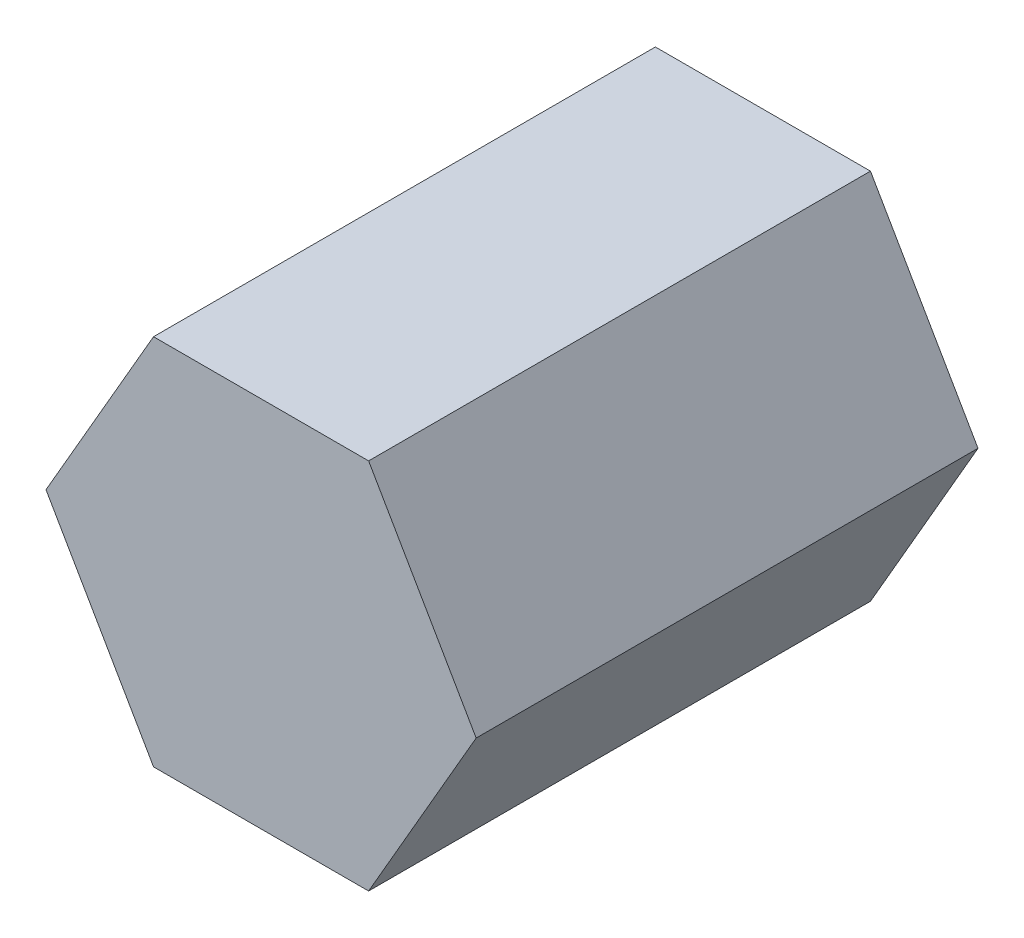
ISO-10303-21;
HEADER;
FILE_DESCRIPTION(('STEP AP214'),'2;1');
FILE_NAME('part.step','',(''),(''),'','','');
FILE_SCHEMA(('AUTOMOTIVE_DESIGN { 1 0 10303 214 1 1 1 1 }'));
ENDSEC;
DATA;
#1=APPLICATION_CONTEXT('core data for automotive mechanical design processes');
#2=APPLICATION_PROTOCOL_DEFINITION('international standard','automotive_design',2000,#1);
#3=PRODUCT_CONTEXT('',#1,'mechanical');
#4=PRODUCT('Part','Part','',(#3));
#5=PRODUCT_RELATED_PRODUCT_CATEGORY('part','',(#4));
#6=PRODUCT_DEFINITION_FORMATION('','',#4);
#7=PRODUCT_DEFINITION_CONTEXT('part definition',#1,'design');
#8=PRODUCT_DEFINITION('design','',#6,#7);
#9=PRODUCT_DEFINITION_SHAPE('','',#8);
#10=(LENGTH_UNIT() NAMED_UNIT(*) SI_UNIT(.MILLI.,.METRE.));
#11=(NAMED_UNIT(*) PLANE_ANGLE_UNIT() SI_UNIT($,.RADIAN.));
#12=(NAMED_UNIT(*) SI_UNIT($,.STERADIAN.) SOLID_ANGLE_UNIT());
#13=UNCERTAINTY_MEASURE_WITH_UNIT(LENGTH_MEASURE(1.E-05),#10,'distance_accuracy_value','');
#14=(GEOMETRIC_REPRESENTATION_CONTEXT(3) GLOBAL_UNCERTAINTY_ASSIGNED_CONTEXT((#13)) GLOBAL_UNIT_ASSIGNED_CONTEXT((#10,
#11,#12)) REPRESENTATION_CONTEXT('',''));
#15=CARTESIAN_POINT('',(0.,0.,0.));
#16=DIRECTION('',(0.,0.,1.));
#17=DIRECTION('',(1.,0.,0.));
#18=AXIS2_PLACEMENT_3D('',#15,#16,#17);
#19=CARTESIAN_POINT('',(-1.5,-2.59807621135332,7.));
#20=DIRECTION('',(0.,1.,0.));
#21=DIRECTION('',(-1.,0.,0.));
#22=AXIS2_PLACEMENT_3D('',#19,#20,#21);
#23=PLANE('',#22);
#24=DIRECTION('',(1.,0.,0.));
#25=VECTOR('',#24,1.);
#26=CARTESIAN_POINT('',(-1.5,-2.59807621135332,0.));
#27=LINE('',#26,#25);
#28=CARTESIAN_POINT('',(-1.5,-2.59807621135332,0.));
#29=VERTEX_POINT('',#28);
#30=CARTESIAN_POINT('',(1.5,-2.59807621135332,0.));
#31=VERTEX_POINT('',#30);
#32=EDGE_CURVE('E117',#29,#31,#27,.T.);
#33=ORIENTED_EDGE('',*,*,#32,.T.);
#34=DIRECTION('',(0.,0.,-1.));
#35=VECTOR('',#34,1.);
#36=CARTESIAN_POINT('',(1.5,-2.59807621135332,7.));
#37=LINE('',#36,#35);
#38=CARTESIAN_POINT('',(1.5,-2.59807621135332,7.));
#39=VERTEX_POINT('',#38);
#40=EDGE_CURVE('E11',#39,#31,#37,.T.);
#41=ORIENTED_EDGE('',*,*,#40,.F.);
#42=DIRECTION('',(1.,0.,0.));
#43=VECTOR('',#42,1.);
#44=CARTESIAN_POINT('',(-1.5,-2.59807621135332,7.));
#45=LINE('',#44,#43);
#46=CARTESIAN_POINT('',(-1.5,-2.59807621135332,7.));
#47=VERTEX_POINT('',#46);
#48=EDGE_CURVE('E127',#47,#39,#45,.T.);
#49=ORIENTED_EDGE('',*,*,#48,.F.);
#50=DIRECTION('',(0.,0.,-1.));
#51=VECTOR('',#50,1.);
#52=CARTESIAN_POINT('',(-1.5,-2.59807621135332,7.));
#53=LINE('',#52,#51);
#54=EDGE_CURVE('E113',#47,#29,#53,.T.);
#55=ORIENTED_EDGE('',*,*,#54,.T.);
#56=EDGE_LOOP('',(#33,#41,#49,#55));
#57=FACE_BOUND('',#56,.T.);
#58=ADVANCED_FACE('F33',(#57),#23,.F.);
#59=CARTESIAN_POINT('',(1.5,-2.59807621135332,7.));
#60=DIRECTION('',(-0.866025403784439,0.5,0.));
#61=DIRECTION('',(-0.5,-0.866025403784439,0.));
#62=AXIS2_PLACEMENT_3D('',#59,#60,#61);
#63=PLANE('',#62);
#64=DIRECTION('',(0.5,0.866025403784439,0.));
#65=VECTOR('',#64,1.);
#66=CARTESIAN_POINT('',(1.5,-2.59807621135332,0.));
#67=LINE('',#66,#65);
#68=CARTESIAN_POINT('',(3.,0.,0.));
#69=VERTEX_POINT('',#68);
#70=EDGE_CURVE('E120',#31,#69,#67,.T.);
#71=ORIENTED_EDGE('',*,*,#70,.T.);
#72=DIRECTION('',(0.,0.,-1.));
#73=VECTOR('',#72,1.);
#74=CARTESIAN_POINT('',(3.,0.,7.));
#75=LINE('',#74,#73);
#76=CARTESIAN_POINT('',(3.,0.,7.));
#77=VERTEX_POINT('',#76);
#78=EDGE_CURVE('E41',#77,#69,#75,.T.);
#79=ORIENTED_EDGE('',*,*,#78,.F.);
#80=DIRECTION('',(0.5,0.866025403784439,0.));
#81=VECTOR('',#80,1.);
#82=CARTESIAN_POINT('',(1.5,-2.59807621135332,7.));
#83=LINE('',#82,#81);
#84=EDGE_CURVE('E86',#39,#77,#83,.T.);
#85=ORIENTED_EDGE('',*,*,#84,.F.);
#86=ORIENTED_EDGE('',*,*,#40,.T.);
#87=EDGE_LOOP('',(#71,#79,#85,#86));
#88=FACE_BOUND('',#87,.T.);
#89=ADVANCED_FACE('F151',(#88),#63,.F.);
#90=CARTESIAN_POINT('',(3.,0.,7.));
#91=DIRECTION('',(-0.866025403784438,-0.5,0.));
#92=DIRECTION('',(0.5,-0.866025403784439,0.));
#93=AXIS2_PLACEMENT_3D('',#90,#91,#92);
#94=PLANE('',#93);
#95=DIRECTION('',(-0.5,0.866025403784439,0.));
#96=VECTOR('',#95,1.);
#97=CARTESIAN_POINT('',(3.,0.,0.));
#98=LINE('',#97,#96);
#99=CARTESIAN_POINT('',(1.5,2.59807621135332,0.));
#100=VERTEX_POINT('',#99);
#101=EDGE_CURVE('E122',#69,#100,#98,.T.);
#102=ORIENTED_EDGE('',*,*,#101,.T.);
#103=DIRECTION('',(0.,0.,-1.));
#104=VECTOR('',#103,1.);
#105=CARTESIAN_POINT('',(1.5,2.59807621135332,7.));
#106=LINE('',#105,#104);
#107=CARTESIAN_POINT('',(1.5,2.59807621135332,7.));
#108=VERTEX_POINT('',#107);
#109=EDGE_CURVE('E108',#108,#100,#106,.T.);
#110=ORIENTED_EDGE('',*,*,#109,.F.);
#111=DIRECTION('',(-0.5,0.866025403784439,0.));
#112=VECTOR('',#111,1.);
#113=CARTESIAN_POINT('',(3.,0.,7.));
#114=LINE('',#113,#112);
#115=EDGE_CURVE('E99',#77,#108,#114,.T.);
#116=ORIENTED_EDGE('',*,*,#115,.F.);
#117=ORIENTED_EDGE('',*,*,#78,.T.);
#118=EDGE_LOOP('',(#102,#110,#116,#117));
#119=FACE_BOUND('',#118,.T.);
#120=ADVANCED_FACE('F133',(#119),#94,.F.);
#121=CARTESIAN_POINT('',(1.5,2.59807621135332,7.));
#122=DIRECTION('',(0.,-1.,0.));
#123=DIRECTION('',(1.,0.,0.));
#124=AXIS2_PLACEMENT_3D('',#121,#122,#123);
#125=PLANE('',#124);
#126=DIRECTION('',(-1.,0.,0.));
#127=VECTOR('',#126,1.);
#128=CARTESIAN_POINT('',(1.5,2.59807621135332,0.));
#129=LINE('',#128,#127);
#130=CARTESIAN_POINT('',(-1.5,2.59807621135332,0.));
#131=VERTEX_POINT('',#130);
#132=EDGE_CURVE('E107',#100,#131,#129,.T.);
#133=ORIENTED_EDGE('',*,*,#132,.T.);
#134=DIRECTION('',(0.,0.,-1.));
#135=VECTOR('',#134,1.);
#136=CARTESIAN_POINT('',(-1.5,2.59807621135332,7.));
#137=LINE('',#136,#135);
#138=CARTESIAN_POINT('',(-1.5,2.59807621135332,7.));
#139=VERTEX_POINT('',#138);
#140=EDGE_CURVE('E104',#139,#131,#137,.T.);
#141=ORIENTED_EDGE('',*,*,#140,.F.);
#142=DIRECTION('',(-1.,0.,0.));
#143=VECTOR('',#142,1.);
#144=CARTESIAN_POINT('',(1.5,2.59807621135332,7.));
#145=LINE('',#144,#143);
#146=EDGE_CURVE('E93',#108,#139,#145,.T.);
#147=ORIENTED_EDGE('',*,*,#146,.F.);
#148=ORIENTED_EDGE('',*,*,#109,.T.);
#149=EDGE_LOOP('',(#133,#141,#147,#148));
#150=FACE_BOUND('',#149,.T.);
#151=ADVANCED_FACE('F105',(#150),#125,.F.);
#152=CARTESIAN_POINT('',(-1.5,2.59807621135332,7.));
#153=DIRECTION('',(0.866025403784439,-0.5,0.));
#154=DIRECTION('',(0.5,0.866025403784439,0.));
#155=AXIS2_PLACEMENT_3D('',#152,#153,#154);
#156=PLANE('',#155);
#157=DIRECTION('',(-0.5,-0.866025403784439,0.));
#158=VECTOR('',#157,1.);
#159=CARTESIAN_POINT('',(-1.5,2.59807621135332,0.));
#160=LINE('',#159,#158);
#161=CARTESIAN_POINT('',(-3.,0.,0.));
#162=VERTEX_POINT('',#161);
#163=EDGE_CURVE('E72',#131,#162,#160,.T.);
#164=ORIENTED_EDGE('',*,*,#163,.T.);
#165=DIRECTION('',(0.,0.,-1.));
#166=VECTOR('',#165,1.);
#167=CARTESIAN_POINT('',(-3.,0.,7.));
#168=LINE('',#167,#166);
#169=CARTESIAN_POINT('',(-3.,0.,7.));
#170=VERTEX_POINT('',#169);
#171=EDGE_CURVE('E109',#170,#162,#168,.T.);
#172=ORIENTED_EDGE('',*,*,#171,.F.);
#173=DIRECTION('',(-0.5,-0.866025403784439,0.));
#174=VECTOR('',#173,1.);
#175=CARTESIAN_POINT('',(-1.5,2.59807621135332,7.));
#176=LINE('',#175,#174);
#177=EDGE_CURVE('E97',#139,#170,#176,.T.);
#178=ORIENTED_EDGE('',*,*,#177,.F.);
#179=ORIENTED_EDGE('',*,*,#140,.T.);
#180=EDGE_LOOP('',(#164,#172,#178,#179));
#181=FACE_BOUND('',#180,.T.);
#182=ADVANCED_FACE('F111',(#181),#156,.F.);
#183=CARTESIAN_POINT('',(-3.,0.,7.));
#184=DIRECTION('',(0.866025403784439,0.5,0.));
#185=DIRECTION('',(-0.5,0.866025403784439,0.));
#186=AXIS2_PLACEMENT_3D('',#183,#184,#185);
#187=PLANE('',#186);
#188=DIRECTION('',(0.5,-0.866025403784439,0.));
#189=VECTOR('',#188,1.);
#190=CARTESIAN_POINT('',(-3.,0.,0.));
#191=LINE('',#190,#189);
#192=EDGE_CURVE('E78',#162,#29,#191,.T.);
#193=ORIENTED_EDGE('',*,*,#192,.T.);
#194=ORIENTED_EDGE('',*,*,#54,.F.);
#195=DIRECTION('',(0.5,-0.866025403784439,0.));
#196=VECTOR('',#195,1.);
#197=CARTESIAN_POINT('',(-3.,0.,7.));
#198=LINE('',#197,#196);
#199=EDGE_CURVE('E49',#170,#47,#198,.T.);
#200=ORIENTED_EDGE('',*,*,#199,.F.);
#201=ORIENTED_EDGE('',*,*,#171,.T.);
#202=EDGE_LOOP('',(#193,#194,#200,#201));
#203=FACE_BOUND('',#202,.T.);
#204=ADVANCED_FACE('F140',(#203),#187,.F.);
#205=CARTESIAN_POINT('',(0.,0.,7.));
#206=DIRECTION('',(0.,0.,1.));
#207=DIRECTION('',(1.,0.,0.));
#208=AXIS2_PLACEMENT_3D('',#205,#206,#207);
#209=PLANE('',#208);
#210=ORIENTED_EDGE('',*,*,#48,.T.);
#211=ORIENTED_EDGE('',*,*,#84,.T.);
#212=ORIENTED_EDGE('',*,*,#115,.T.);
#213=ORIENTED_EDGE('',*,*,#146,.T.);
#214=ORIENTED_EDGE('',*,*,#177,.T.);
#215=ORIENTED_EDGE('',*,*,#199,.T.);
#216=EDGE_LOOP('',(#210,#211,#212,#213,#214,#215));
#217=FACE_BOUND('',#216,.T.);
#218=ADVANCED_FACE('F95',(#217),#209,.T.);
#219=CARTESIAN_POINT('',(0.,0.,0.));
#220=DIRECTION('',(0.,0.,1.));
#221=DIRECTION('',(1.,0.,0.));
#222=AXIS2_PLACEMENT_3D('',#219,#220,#221);
#223=PLANE('',#222);
#224=ORIENTED_EDGE('',*,*,#32,.F.);
#225=ORIENTED_EDGE('',*,*,#192,.F.);
#226=ORIENTED_EDGE('',*,*,#163,.F.);
#227=ORIENTED_EDGE('',*,*,#132,.F.);
#228=ORIENTED_EDGE('',*,*,#101,.F.);
#229=ORIENTED_EDGE('',*,*,#70,.F.);
#230=EDGE_LOOP('',(#224,#225,#226,#227,#228,#229));
#231=FACE_BOUND('',#230,.T.);
#232=ADVANCED_FACE('F136',(#231),#223,.F.);
#233=CLOSED_SHELL('',(#58,#89,#120,#151,#182,#204,#218,#232));
#234=MANIFOLD_SOLID_BREP('B2',#233);
#235=ADVANCED_BREP_SHAPE_REPRESENTATION('',(#18,#234),#14);
#236=SHAPE_DEFINITION_REPRESENTATION(#9,#235);
ENDSEC;
END-ISO-10303-21;
